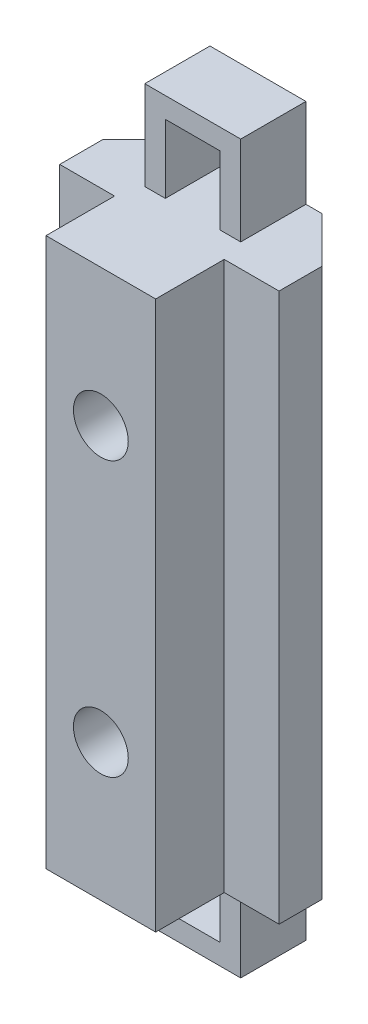
ISO-10303-21;
HEADER;
FILE_DESCRIPTION(('STEP AP214'),'2;1');
FILE_NAME('part.step','',(''),(''),'','','');
FILE_SCHEMA(('AUTOMOTIVE_DESIGN { 1 0 10303 214 1 1 1 1 }'));
ENDSEC;
DATA;
#1=APPLICATION_CONTEXT('core data for automotive mechanical design processes');
#2=APPLICATION_PROTOCOL_DEFINITION('international standard','automotive_design',2000,#1);
#3=PRODUCT_CONTEXT('',#1,'mechanical');
#4=PRODUCT('Part','Part','',(#3));
#5=PRODUCT_RELATED_PRODUCT_CATEGORY('part','',(#4));
#6=PRODUCT_DEFINITION_FORMATION('','',#4);
#7=PRODUCT_DEFINITION_CONTEXT('part definition',#1,'design');
#8=PRODUCT_DEFINITION('design','',#6,#7);
#9=PRODUCT_DEFINITION_SHAPE('','',#8);
#10=(LENGTH_UNIT() NAMED_UNIT(*) SI_UNIT(.MILLI.,.METRE.));
#11=(NAMED_UNIT(*) PLANE_ANGLE_UNIT() SI_UNIT($,.RADIAN.));
#12=(NAMED_UNIT(*) SI_UNIT($,.STERADIAN.) SOLID_ANGLE_UNIT());
#13=UNCERTAINTY_MEASURE_WITH_UNIT(LENGTH_MEASURE(1.E-05),#10,'distance_accuracy_value','');
#14=(GEOMETRIC_REPRESENTATION_CONTEXT(3) GLOBAL_UNCERTAINTY_ASSIGNED_CONTEXT((#13)) GLOBAL_UNIT_ASSIGNED_CONTEXT((#10,
#11,#12)) REPRESENTATION_CONTEXT('',''));
#15=CARTESIAN_POINT('',(0.,0.,0.));
#16=DIRECTION('',(0.,0.,1.));
#17=DIRECTION('',(1.,0.,0.));
#18=AXIS2_PLACEMENT_3D('',#15,#16,#17);
#19=CARTESIAN_POINT('',(0.,0.,0.));
#20=DIRECTION('',(0.,0.,-1.));
#21=DIRECTION('',(-1.,0.,0.));
#22=AXIS2_PLACEMENT_3D('',#19,#20,#21);
#23=PLANE('',#22);
#24=DIRECTION('',(0.,-1.,0.));
#25=VECTOR('',#24,1.);
#26=CARTESIAN_POINT('',(-1.74789245707197,40.,0.));
#27=LINE('',#26,#25);
#28=CARTESIAN_POINT('',(-1.74789245707196,40.,0.));
#29=VERTEX_POINT('',#28);
#30=CARTESIAN_POINT('',(-1.74789245707196,0.,0.));
#31=VERTEX_POINT('',#30);
#32=EDGE_CURVE('E63',#29,#31,#27,.T.);
#33=ORIENTED_EDGE('',*,*,#32,.F.);
#34=DIRECTION('',(1.,0.,0.));
#35=VECTOR('',#34,1.);
#36=CARTESIAN_POINT('',(9.75210754292804,40.,0.));
#37=LINE('',#36,#35);
#38=CARTESIAN_POINT('',(-5.74789245707196,40.,0.));
#39=VERTEX_POINT('',#38);
#40=EDGE_CURVE('E463',#39,#29,#37,.T.);
#41=ORIENTED_EDGE('',*,*,#40,.F.);
#42=DIRECTION('',(0.,1.,0.));
#43=VECTOR('',#42,1.);
#44=CARTESIAN_POINT('',(-5.74789245707196,40.,0.));
#45=LINE('',#44,#43);
#46=CARTESIAN_POINT('',(-5.74789245707196,0.,0.));
#47=VERTEX_POINT('',#46);
#48=EDGE_CURVE('E367',#47,#39,#45,.T.);
#49=ORIENTED_EDGE('',*,*,#48,.F.);
#50=DIRECTION('',(-1.,0.,0.));
#51=VECTOR('',#50,1.);
#52=CARTESIAN_POINT('',(9.75210754292804,0.,0.));
#53=LINE('',#52,#51);
#54=EDGE_CURVE('E465',#31,#47,#53,.T.);
#55=ORIENTED_EDGE('',*,*,#54,.F.);
#56=EDGE_LOOP('',(#33,#41,#49,#55));
#57=FACE_BOUND('',#56,.T.);
#58=ADVANCED_FACE('F38',(#57),#23,.F.);
#59=CARTESIAN_POINT('',(0.,0.,0.));
#60=DIRECTION('',(0.,1.,0.));
#61=DIRECTION('',(0.,0.,1.));
#62=AXIS2_PLACEMENT_3D('',#59,#60,#61);
#63=PLANE('',#62);
#64=DIRECTION('',(1.,0.,0.));
#65=VECTOR('',#64,1.);
#66=CARTESIAN_POINT('',(0.,0.,-5.32842712474617));
#67=LINE('',#66,#65);
#68=CARTESIAN_POINT('',(0.,0.,-5.32842712474617));
#69=VERTEX_POINT('',#68);
#70=CARTESIAN_POINT('',(0.252107542927994,0.,-5.32842712474617));
#71=VERTEX_POINT('',#70);
#72=EDGE_CURVE('E343',#69,#71,#67,.T.);
#73=ORIENTED_EDGE('',*,*,#72,.F.);
#74=DIRECTION('',(0.,0.,1.));
#75=VECTOR('',#74,1.);
#76=CARTESIAN_POINT('',(0.,0.,-16.012284561916));
#77=LINE('',#76,#75);
#78=CARTESIAN_POINT('',(0.,0.,-6.45979797464463));
#79=VERTEX_POINT('',#78);
#80=EDGE_CURVE('E324',#79,#69,#77,.T.);
#81=ORIENTED_EDGE('',*,*,#80,.F.);
#82=DIRECTION('',(1.,0.,0.));
#83=VECTOR('',#82,1.);
#84=CARTESIAN_POINT('',(0.,0.,-6.45979797464463));
#85=LINE('',#84,#83);
#86=CARTESIAN_POINT('',(4.252107542928,0.,-6.45979797464463));
#87=VERTEX_POINT('',#86);
#88=EDGE_CURVE('E338',#79,#87,#85,.T.);
#89=ORIENTED_EDGE('',*,*,#88,.T.);
#90=DIRECTION('',(0.,0.,-1.));
#91=VECTOR('',#90,1.);
#92=CARTESIAN_POINT('',(4.25210754292799,0.,-1.70258565579235));
#93=LINE('',#92,#91);
#94=CARTESIAN_POINT('',(4.25210754292799,0.,-1.70258565579235));
#95=VERTEX_POINT('',#94);
#96=EDGE_CURVE('E430',#95,#87,#93,.T.);
#97=ORIENTED_EDGE('',*,*,#96,.F.);
#98=DIRECTION('',(-1.,0.,0.));
#99=VECTOR('',#98,1.);
#100=CARTESIAN_POINT('',(0.,0.,-1.70258565579235));
#101=LINE('',#100,#99);
#102=CARTESIAN_POINT('',(5.75210754292799,0.,-1.70258565579235));
#103=VERTEX_POINT('',#102);
#104=EDGE_CURVE('E453',#103,#95,#101,.T.);
#105=ORIENTED_EDGE('',*,*,#104,.F.);
#106=DIRECTION('',(0.,0.,-1.));
#107=VECTOR('',#106,1.);
#108=CARTESIAN_POINT('',(5.75210754292799,0.,-1.70258565579235));
#109=LINE('',#108,#107);
#110=CARTESIAN_POINT('',(5.75210754292799,0.,-6.45979797464463));
#111=VERTEX_POINT('',#110);
#112=EDGE_CURVE('E434',#103,#111,#109,.T.);
#113=ORIENTED_EDGE('',*,*,#112,.T.);
#114=CARTESIAN_POINT('',(6.92368041818186,0.,-6.45979797464463));
#115=VERTEX_POINT('',#114);
#116=EDGE_CURVE('E339',#111,#115,#85,.T.);
#117=ORIENTED_EDGE('',*,*,#116,.T.);
#118=DIRECTION('',(0.707106781186549,0.,0.707106781186546));
#119=VECTOR('',#118,1.);
#120=CARTESIAN_POINT('',(6.69173919641323,0.,-6.69173919641326));
#121=LINE('',#120,#119);
#122=CARTESIAN_POINT('',(10.252107542928,0.,-3.13137084989848));
#123=VERTEX_POINT('',#122);
#124=EDGE_CURVE('E331',#115,#123,#121,.T.);
#125=ORIENTED_EDGE('',*,*,#124,.T.);
#126=DIRECTION('',(0.,0.,-1.));
#127=VECTOR('',#126,1.);
#128=CARTESIAN_POINT('',(10.252107542928,0.,-2.5));
#129=LINE('',#128,#127);
#130=CARTESIAN_POINT('',(10.252107542928,0.,0.));
#131=VERTEX_POINT('',#130);
#132=EDGE_CURVE('E378',#131,#123,#129,.T.);
#133=ORIENTED_EDGE('',*,*,#132,.F.);
#134=CARTESIAN_POINT('',(6.25210754292804,0.,0.));
#135=VERTEX_POINT('',#134);
#136=EDGE_CURVE('E248',#131,#135,#53,.T.);
#137=ORIENTED_EDGE('',*,*,#136,.T.);
#138=DIRECTION('',(0.,0.,-1.));
#139=VECTOR('',#138,1.);
#140=CARTESIAN_POINT('',(6.25210754292804,0.,5.));
#141=LINE('',#140,#139);
#142=CARTESIAN_POINT('',(6.25210754292804,0.,5.));
#143=VERTEX_POINT('',#142);
#144=EDGE_CURVE('E55',#143,#135,#141,.T.);
#145=ORIENTED_EDGE('',*,*,#144,.F.);
#146=DIRECTION('',(1.,0.,0.));
#147=VECTOR('',#146,1.);
#148=CARTESIAN_POINT('',(0.,0.,5.));
#149=LINE('',#148,#147);
#150=CARTESIAN_POINT('',(-1.74789245707196,0.,5.));
#151=VERTEX_POINT('',#150);
#152=EDGE_CURVE('E11',#151,#143,#149,.T.);
#153=ORIENTED_EDGE('',*,*,#152,.F.);
#154=DIRECTION('',(0.,0.,1.));
#155=VECTOR('',#154,1.);
#156=CARTESIAN_POINT('',(-1.74789245707196,0.,5.));
#157=LINE('',#156,#155);
#158=EDGE_CURVE('E264',#31,#151,#157,.T.);
#159=ORIENTED_EDGE('',*,*,#158,.F.);
#160=ORIENTED_EDGE('',*,*,#54,.T.);
#161=DIRECTION('',(0.,0.,1.));
#162=VECTOR('',#161,1.);
#163=CARTESIAN_POINT('',(-5.74789245707196,0.,-2.5));
#164=LINE('',#163,#162);
#165=CARTESIAN_POINT('',(-5.74789245707196,0.,-3.13137084989846));
#166=VERTEX_POINT('',#165);
#167=EDGE_CURVE('E334',#166,#47,#164,.T.);
#168=ORIENTED_EDGE('',*,*,#167,.F.);
#169=DIRECTION('',(0.707106781186544,0.,-0.707106781186551));
#170=VECTOR('',#169,1.);
#171=CARTESIAN_POINT('',(-4.43963165348524,0.,-4.4396316534852));
#172=LINE('',#171,#170);
#173=CARTESIAN_POINT('',(-2.41946533232582,0.,-6.45979797464463));
#174=VERTEX_POINT('',#173);
#175=EDGE_CURVE('E340',#166,#174,#172,.T.);
#176=ORIENTED_EDGE('',*,*,#175,.T.);
#177=CARTESIAN_POINT('',(-1.247892457072,0.,-6.45979797464463));
#178=VERTEX_POINT('',#177);
#179=EDGE_CURVE('E335',#174,#178,#85,.T.);
#180=ORIENTED_EDGE('',*,*,#179,.T.);
#181=DIRECTION('',(0.,0.,-1.));
#182=VECTOR('',#181,1.);
#183=CARTESIAN_POINT('',(-1.24789245707201,0.,-1.70258565579235));
#184=LINE('',#183,#182);
#185=CARTESIAN_POINT('',(-1.24789245707201,0.,-1.70258565579235));
#186=VERTEX_POINT('',#185);
#187=EDGE_CURVE('E440',#186,#178,#184,.T.);
#188=ORIENTED_EDGE('',*,*,#187,.F.);
#189=CARTESIAN_POINT('',(0.252107542927994,0.,-1.70258565579235));
#190=VERTEX_POINT('',#189);
#191=EDGE_CURVE('E428',#190,#186,#101,.T.);
#192=ORIENTED_EDGE('',*,*,#191,.F.);
#193=DIRECTION('',(0.,0.,-1.));
#194=VECTOR('',#193,1.);
#195=CARTESIAN_POINT('',(0.252107542927994,0.,-1.70258565579235));
#196=LINE('',#195,#194);
#197=EDGE_CURVE('E437',#190,#71,#196,.T.);
#198=ORIENTED_EDGE('',*,*,#197,.T.);
#199=EDGE_LOOP('',(#73,#81,#89,#97,#105,#113,#117,#125,#133,#137,#145,#153,#159,#160,#168,#176,
#180,#188,#192,#198));
#200=FACE_BOUND('',#199,.T.);
#201=ADVANCED_FACE('F246',(#200),#63,.F.);
#202=CARTESIAN_POINT('',(0.,55.2643375224737,-5.32842712474617));
#203=DIRECTION('',(0.,0.,1.));
#204=DIRECTION('',(1.,0.,0.));
#205=AXIS2_PLACEMENT_3D('',#202,#203,#204);
#206=PLANE('',#205);
#207=DIRECTION('',(-1.,0.,0.));
#208=VECTOR('',#207,1.);
#209=CARTESIAN_POINT('',(0.,-5.,-5.32842712474617));
#210=LINE('',#209,#208);
#211=CARTESIAN_POINT('',(0.252107542927994,-5.,-5.32842712474618));
#212=VERTEX_POINT('',#211);
#213=CARTESIAN_POINT('',(0.,-5.,-5.32842712474617));
#214=VERTEX_POINT('',#213);
#215=EDGE_CURVE('E304',#212,#214,#210,.T.);
#216=ORIENTED_EDGE('',*,*,#215,.T.);
#217=DIRECTION('',(0.,1.,0.));
#218=VECTOR('',#217,1.);
#219=CARTESIAN_POINT('',(0.,0.,-5.32842712474617));
#220=LINE('',#219,#218);
#221=EDGE_CURVE('E307',#214,#69,#220,.T.);
#222=ORIENTED_EDGE('',*,*,#221,.T.);
#223=ORIENTED_EDGE('',*,*,#72,.T.);
#224=DIRECTION('',(0.,1.,0.));
#225=VECTOR('',#224,1.);
#226=CARTESIAN_POINT('',(0.252107542927994,0.,-5.32842712474618));
#227=LINE('',#226,#225);
#228=EDGE_CURVE('E380',#212,#71,#227,.T.);
#229=ORIENTED_EDGE('',*,*,#228,.F.);
#230=EDGE_LOOP('',(#216,#222,#223,#229));
#231=FACE_BOUND('',#230,.T.);
#232=ADVANCED_FACE('F493',(#231),#206,.F.);
#233=CARTESIAN_POINT('',(0.,40.,0.));
#234=DIRECTION('',(0.,1.,0.));
#235=DIRECTION('',(0.,0.,1.));
#236=AXIS2_PLACEMENT_3D('',#233,#234,#235);
#237=PLANE('',#236);
#238=DIRECTION('',(0.,0.,-1.));
#239=VECTOR('',#238,1.);
#240=CARTESIAN_POINT('',(4.252107542928,40.,-1.70258565579235));
#241=LINE('',#240,#239);
#242=CARTESIAN_POINT('',(4.252107542928,40.,-1.70258565579235));
#243=VERTEX_POINT('',#242);
#244=CARTESIAN_POINT('',(4.25210754292799,40.,-6.45979797464463));
#245=VERTEX_POINT('',#244);
#246=EDGE_CURVE('E407',#243,#245,#241,.T.);
#247=ORIENTED_EDGE('',*,*,#246,.T.);
#248=DIRECTION('',(1.,0.,0.));
#249=VECTOR('',#248,1.);
#250=CARTESIAN_POINT('',(0.,40.,-6.45979797464463));
#251=LINE('',#250,#249);
#252=CARTESIAN_POINT('',(0.252107542927993,40.,-6.45979797464463));
#253=VERTEX_POINT('',#252);
#254=EDGE_CURVE('E353',#253,#245,#251,.T.);
#255=ORIENTED_EDGE('',*,*,#254,.F.);
#256=DIRECTION('',(0.,0.,-1.));
#257=VECTOR('',#256,1.);
#258=CARTESIAN_POINT('',(0.252107542927995,40.,-1.70258565579235));
#259=LINE('',#258,#257);
#260=CARTESIAN_POINT('',(0.252107542927995,40.,-1.70258565579235));
#261=VERTEX_POINT('',#260);
#262=EDGE_CURVE('E418',#261,#253,#259,.T.);
#263=ORIENTED_EDGE('',*,*,#262,.F.);
#264=DIRECTION('',(1.,0.,0.));
#265=VECTOR('',#264,1.);
#266=CARTESIAN_POINT('',(0.,40.,-1.70258565579235));
#267=LINE('',#266,#265);
#268=CARTESIAN_POINT('',(-1.24789245707201,40.,-1.70258565579235));
#269=VERTEX_POINT('',#268);
#270=EDGE_CURVE('E397',#269,#261,#267,.T.);
#271=ORIENTED_EDGE('',*,*,#270,.F.);
#272=DIRECTION('',(0.,0.,-1.));
#273=VECTOR('',#272,1.);
#274=CARTESIAN_POINT('',(-1.24789245707201,40.,-1.70258565579235));
#275=LINE('',#274,#273);
#276=CARTESIAN_POINT('',(-1.247892457072,40.,-6.45979797464463));
#277=VERTEX_POINT('',#276);
#278=EDGE_CURVE('E416',#269,#277,#275,.T.);
#279=ORIENTED_EDGE('',*,*,#278,.T.);
#280=CARTESIAN_POINT('',(-2.41946533232582,40.,-6.45979797464463));
#281=VERTEX_POINT('',#280);
#282=EDGE_CURVE('E350',#281,#277,#251,.T.);
#283=ORIENTED_EDGE('',*,*,#282,.F.);
#284=DIRECTION('',(0.707106781186544,0.,-0.707106781186551));
#285=VECTOR('',#284,1.);
#286=CARTESIAN_POINT('',(-4.43963165348524,40.,-4.4396316534852));
#287=LINE('',#286,#285);
#288=CARTESIAN_POINT('',(-5.74789245707196,40.,-3.13137084989846));
#289=VERTEX_POINT('',#288);
#290=EDGE_CURVE('E346',#289,#281,#287,.T.);
#291=ORIENTED_EDGE('',*,*,#290,.F.);
#292=DIRECTION('',(0.,0.,-1.));
#293=VECTOR('',#292,1.);
#294=CARTESIAN_POINT('',(-5.74789245707196,40.,-2.5));
#295=LINE('',#294,#293);
#296=EDGE_CURVE('E370',#39,#289,#295,.T.);
#297=ORIENTED_EDGE('',*,*,#296,.F.);
#298=ORIENTED_EDGE('',*,*,#40,.T.);
#299=DIRECTION('',(0.,0.,-1.));
#300=VECTOR('',#299,1.);
#301=CARTESIAN_POINT('',(-1.74789245707197,40.,5.));
#302=LINE('',#301,#300);
#303=CARTESIAN_POINT('',(-1.74789245707197,40.,5.));
#304=VERTEX_POINT('',#303);
#305=EDGE_CURVE('E260',#304,#29,#302,.T.);
#306=ORIENTED_EDGE('',*,*,#305,.F.);
#307=DIRECTION('',(-1.,0.,0.));
#308=VECTOR('',#307,1.);
#309=CARTESIAN_POINT('',(0.,40.,5.));
#310=LINE('',#309,#308);
#311=CARTESIAN_POINT('',(6.25210754292803,40.,5.));
#312=VERTEX_POINT('',#311);
#313=EDGE_CURVE('E47',#312,#304,#310,.T.);
#314=ORIENTED_EDGE('',*,*,#313,.F.);
#315=DIRECTION('',(0.,0.,1.));
#316=VECTOR('',#315,1.);
#317=CARTESIAN_POINT('',(6.25210754292803,40.,5.));
#318=LINE('',#317,#316);
#319=CARTESIAN_POINT('',(6.25210754292803,40.,0.));
#320=VERTEX_POINT('',#319);
#321=EDGE_CURVE('E254',#320,#312,#318,.T.);
#322=ORIENTED_EDGE('',*,*,#321,.F.);
#323=CARTESIAN_POINT('',(10.252107542928,40.,0.));
#324=VERTEX_POINT('',#323);
#325=EDGE_CURVE('E436',#320,#324,#37,.T.);
#326=ORIENTED_EDGE('',*,*,#325,.T.);
#327=DIRECTION('',(0.,0.,1.));
#328=VECTOR('',#327,1.);
#329=CARTESIAN_POINT('',(10.252107542928,40.,-2.5));
#330=LINE('',#329,#328);
#331=CARTESIAN_POINT('',(10.252107542928,40.,-3.13137084989848));
#332=VERTEX_POINT('',#331);
#333=EDGE_CURVE('E372',#332,#324,#330,.T.);
#334=ORIENTED_EDGE('',*,*,#333,.F.);
#335=DIRECTION('',(0.707106781186549,0.,0.707106781186546));
#336=VECTOR('',#335,1.);
#337=CARTESIAN_POINT('',(6.69173919641323,40.,-6.69173919641326));
#338=LINE('',#337,#336);
#339=CARTESIAN_POINT('',(6.92368041818186,40.,-6.45979797464463));
#340=VERTEX_POINT('',#339);
#341=EDGE_CURVE('E313',#340,#332,#338,.T.);
#342=ORIENTED_EDGE('',*,*,#341,.F.);
#343=CARTESIAN_POINT('',(5.75210754292799,40.,-6.45979797464463));
#344=VERTEX_POINT('',#343);
#345=EDGE_CURVE('E354',#344,#340,#251,.T.);
#346=ORIENTED_EDGE('',*,*,#345,.F.);
#347=DIRECTION('',(0.,0.,-1.));
#348=VECTOR('',#347,1.);
#349=CARTESIAN_POINT('',(5.75210754292799,40.,-1.70258565579235));
#350=LINE('',#349,#348);
#351=CARTESIAN_POINT('',(5.75210754292799,40.,-1.70258565579235));
#352=VERTEX_POINT('',#351);
#353=EDGE_CURVE('E410',#352,#344,#350,.T.);
#354=ORIENTED_EDGE('',*,*,#353,.F.);
#355=EDGE_CURVE('E400',#243,#352,#267,.T.);
#356=ORIENTED_EDGE('',*,*,#355,.F.);
#357=EDGE_LOOP('',(#247,#255,#263,#271,#279,#283,#291,#297,#298,#306,#314,#322,#326,#334,#342,
#346,#354,#356));
#358=FACE_BOUND('',#357,.T.);
#359=ADVANCED_FACE('F498',(#358),#237,.T.);
#360=CARTESIAN_POINT('',(2.25210754292804,10.,-2.));
#361=DIRECTION('',(0.,0.,1.));
#362=DIRECTION('',(1.,0.,0.));
#363=AXIS2_PLACEMENT_3D('',#360,#361,#362);
#364=CYLINDRICAL_SURFACE('',#363,2.);
#365=CARTESIAN_POINT('',(2.25210754292804,10.,-3.55558709696881));
#366=DIRECTION('',(0.,0.,-1.));
#367=DIRECTION('',(-1.,0.,0.));
#368=AXIS2_PLACEMENT_3D('',#365,#366,#367);
#369=CIRCLE('',#368,2.);
#370=CARTESIAN_POINT('',(0.252107542928039,10.,-3.55558709696881));
#371=VERTEX_POINT('',#370);
#372=EDGE_CURVE('E270',#371,#371,#369,.T.);
#373=ORIENTED_EDGE('',*,*,#372,.T.);
#374=EDGE_LOOP('',(#373));
#375=FACE_BOUND('',#374,.T.);
#376=CARTESIAN_POINT('',(2.25210754292804,10.,5.));
#377=DIRECTION('',(0.,0.,1.));
#378=DIRECTION('',(1.,0.,0.));
#379=AXIS2_PLACEMENT_3D('',#376,#377,#378);
#380=CIRCLE('',#379,2.);
#381=CARTESIAN_POINT('',(4.25210754292804,10.,5.));
#382=VERTEX_POINT('',#381);
#383=EDGE_CURVE('E466',#382,#382,#380,.T.);
#384=ORIENTED_EDGE('',*,*,#383,.T.);
#385=EDGE_LOOP('',(#384));
#386=FACE_BOUND('',#385,.T.);
#387=ADVANCED_FACE('F486',(#375,#386),#364,.F.);
#388=CARTESIAN_POINT('',(2.25210754292803,30.,-2.));
#389=DIRECTION('',(0.,0.,1.));
#390=DIRECTION('',(1.,0.,0.));
#391=AXIS2_PLACEMENT_3D('',#388,#389,#390);
#392=CYLINDRICAL_SURFACE('',#391,2.);
#393=CARTESIAN_POINT('',(2.25210754292803,30.,-3.55558709696882));
#394=DIRECTION('',(0.,0.,-1.));
#395=DIRECTION('',(-1.,0.,0.));
#396=AXIS2_PLACEMENT_3D('',#393,#394,#395);
#397=CIRCLE('',#396,2.);
#398=CARTESIAN_POINT('',(0.252107542928033,30.,-3.55558709696882));
#399=VERTEX_POINT('',#398);
#400=EDGE_CURVE('E275',#399,#399,#397,.T.);
#401=ORIENTED_EDGE('',*,*,#400,.T.);
#402=EDGE_LOOP('',(#401));
#403=FACE_BOUND('',#402,.T.);
#404=CARTESIAN_POINT('',(2.25210754292803,30.,5.));
#405=DIRECTION('',(0.,0.,1.));
#406=DIRECTION('',(1.,0.,0.));
#407=AXIS2_PLACEMENT_3D('',#404,#405,#406);
#408=CIRCLE('',#407,2.);
#409=CARTESIAN_POINT('',(4.25210754292803,30.,5.));
#410=VERTEX_POINT('',#409);
#411=EDGE_CURVE('E42',#410,#410,#408,.T.);
#412=ORIENTED_EDGE('',*,*,#411,.T.);
#413=EDGE_LOOP('',(#412));
#414=FACE_BOUND('',#413,.T.);
#415=ADVANCED_FACE('F40',(#403,#414),#392,.F.);
#416=CARTESIAN_POINT('',(0.,0.,5.));
#417=DIRECTION('',(0.,0.,1.));
#418=DIRECTION('',(1.,0.,0.));
#419=AXIS2_PLACEMENT_3D('',#416,#417,#418);
#420=PLANE('',#419);
#421=ORIENTED_EDGE('',*,*,#411,.F.);
#422=EDGE_LOOP('',(#421));
#423=FACE_BOUND('',#422,.T.);
#424=ORIENTED_EDGE('',*,*,#383,.F.);
#425=EDGE_LOOP('',(#424));
#426=FACE_BOUND('',#425,.T.);
#427=ORIENTED_EDGE('',*,*,#152,.T.);
#428=DIRECTION('',(0.,-1.,0.));
#429=VECTOR('',#428,1.);
#430=CARTESIAN_POINT('',(6.25210754292803,40.,5.));
#431=LINE('',#430,#429);
#432=EDGE_CURVE('E238',#312,#143,#431,.T.);
#433=ORIENTED_EDGE('',*,*,#432,.F.);
#434=ORIENTED_EDGE('',*,*,#313,.T.);
#435=DIRECTION('',(0.,1.,0.));
#436=VECTOR('',#435,1.);
#437=CARTESIAN_POINT('',(-1.74789245707197,40.,5.));
#438=LINE('',#437,#436);
#439=EDGE_CURVE('E240',#151,#304,#438,.T.);
#440=ORIENTED_EDGE('',*,*,#439,.F.);
#441=EDGE_LOOP('',(#427,#433,#434,#440));
#442=FACE_BOUND('',#441,.T.);
#443=ADVANCED_FACE('F237',(#423,#426,#442),#420,.T.);
#444=ORIENTED_EDGE('',*,*,#325,.F.);
#445=DIRECTION('',(0.,1.,0.));
#446=VECTOR('',#445,1.);
#447=CARTESIAN_POINT('',(6.25210754292803,40.,0.));
#448=LINE('',#447,#446);
#449=EDGE_CURVE('E249',#135,#320,#448,.T.);
#450=ORIENTED_EDGE('',*,*,#449,.F.);
#451=ORIENTED_EDGE('',*,*,#136,.F.);
#452=DIRECTION('',(0.,-1.,0.));
#453=VECTOR('',#452,1.);
#454=CARTESIAN_POINT('',(10.252107542928,40.,0.));
#455=LINE('',#454,#453);
#456=EDGE_CURVE('E375',#324,#131,#455,.T.);
#457=ORIENTED_EDGE('',*,*,#456,.F.);
#458=EDGE_LOOP('',(#444,#450,#451,#457));
#459=FACE_BOUND('',#458,.T.);
#460=ADVANCED_FACE('F477',(#459),#23,.F.);
#461=CARTESIAN_POINT('',(0.,-6.5,-1.70258565579235));
#462=DIRECTION('',(0.,-1.,0.));
#463=DIRECTION('',(0.,0.,-1.));
#464=AXIS2_PLACEMENT_3D('',#461,#462,#463);
#465=PLANE('',#464);
#466=DIRECTION('',(0.,0.,-1.));
#467=VECTOR('',#466,1.);
#468=CARTESIAN_POINT('',(-1.24789245707201,-6.5,-1.70258565579235));
#469=LINE('',#468,#467);
#470=CARTESIAN_POINT('',(-1.24789245707201,-6.5,-1.70258565579235));
#471=VERTEX_POINT('',#470);
#472=CARTESIAN_POINT('',(-1.24789245707201,-6.5,-6.45979797464463));
#473=VERTEX_POINT('',#472);
#474=EDGE_CURVE('E441',#471,#473,#469,.T.);
#475=ORIENTED_EDGE('',*,*,#474,.T.);
#476=DIRECTION('',(-1.,0.,0.));
#477=VECTOR('',#476,1.);
#478=CARTESIAN_POINT('',(0.,-6.5,-6.45979797464463));
#479=LINE('',#478,#477);
#480=CARTESIAN_POINT('',(5.75210754292799,-6.5,-6.45979797464463));
#481=VERTEX_POINT('',#480);
#482=EDGE_CURVE('E314',#481,#473,#479,.T.);
#483=ORIENTED_EDGE('',*,*,#482,.F.);
#484=DIRECTION('',(0.,0.,-1.));
#485=VECTOR('',#484,1.);
#486=CARTESIAN_POINT('',(5.75210754292799,-6.5,-1.70258565579235));
#487=LINE('',#486,#485);
#488=CARTESIAN_POINT('',(5.75210754292799,-6.5,-1.70258565579235));
#489=VERTEX_POINT('',#488);
#490=EDGE_CURVE('E438',#489,#481,#487,.T.);
#491=ORIENTED_EDGE('',*,*,#490,.F.);
#492=DIRECTION('',(-1.,0.,0.));
#493=VECTOR('',#492,1.);
#494=CARTESIAN_POINT('',(0.,-6.5,-1.70258565579235));
#495=LINE('',#494,#493);
#496=EDGE_CURVE('E409',#489,#471,#495,.T.);
#497=ORIENTED_EDGE('',*,*,#496,.T.);
#498=EDGE_LOOP('',(#475,#483,#491,#497));
#499=FACE_BOUND('',#498,.T.);
#500=ADVANCED_FACE('F483',(#499),#465,.T.);
#501=CARTESIAN_POINT('',(0.,-5.,-1.70258565579235));
#502=DIRECTION('',(0.,1.,0.));
#503=DIRECTION('',(0.,0.,1.));
#504=AXIS2_PLACEMENT_3D('',#501,#502,#503);
#505=PLANE('',#504);
#506=DIRECTION('',(0.,0.,-1.));
#507=VECTOR('',#506,1.);
#508=CARTESIAN_POINT('',(4.25210754292799,-5.,-1.70258565579235));
#509=LINE('',#508,#507);
#510=CARTESIAN_POINT('',(4.25210754292799,-5.,-1.70258565579235));
#511=VERTEX_POINT('',#510);
#512=CARTESIAN_POINT('',(4.25210754292799,-5.,-6.45979797464463));
#513=VERTEX_POINT('',#512);
#514=EDGE_CURVE('E426',#511,#513,#509,.T.);
#515=ORIENTED_EDGE('',*,*,#514,.T.);
#516=DIRECTION('',(-1.,0.,0.));
#517=VECTOR('',#516,1.);
#518=CARTESIAN_POINT('',(0.,-5.,-6.45979797464463));
#519=LINE('',#518,#517);
#520=CARTESIAN_POINT('',(0.,-5.,-6.45979797464463));
#521=VERTEX_POINT('',#520);
#522=EDGE_CURVE('E322',#513,#521,#519,.T.);
#523=ORIENTED_EDGE('',*,*,#522,.T.);
#524=DIRECTION('',(0.,0.,1.));
#525=VECTOR('',#524,1.);
#526=CARTESIAN_POINT('',(0.,-5.,-16.012284561916));
#527=LINE('',#526,#525);
#528=EDGE_CURVE('E309',#521,#214,#527,.T.);
#529=ORIENTED_EDGE('',*,*,#528,.T.);
#530=ORIENTED_EDGE('',*,*,#215,.F.);
#531=DIRECTION('',(0.,0.,-1.));
#532=VECTOR('',#531,1.);
#533=CARTESIAN_POINT('',(0.252107542927994,-5.,-1.70258565579235));
#534=LINE('',#533,#532);
#535=CARTESIAN_POINT('',(0.252107542927994,-5.,-1.70258565579235));
#536=VERTEX_POINT('',#535);
#537=EDGE_CURVE('E447',#536,#212,#534,.T.);
#538=ORIENTED_EDGE('',*,*,#537,.F.);
#539=DIRECTION('',(1.,0.,0.));
#540=VECTOR('',#539,1.);
#541=CARTESIAN_POINT('',(0.,-5.,-1.70258565579235));
#542=LINE('',#541,#540);
#543=EDGE_CURVE('E429',#536,#511,#542,.T.);
#544=ORIENTED_EDGE('',*,*,#543,.T.);
#545=EDGE_LOOP('',(#515,#523,#529,#530,#538,#544));
#546=FACE_BOUND('',#545,.T.);
#547=ADVANCED_FACE('F572',(#546),#505,.T.);
#548=CARTESIAN_POINT('',(0.,0.,-1.70258565579235));
#549=DIRECTION('',(0.,0.,-1.));
#550=DIRECTION('',(-1.,0.,0.));
#551=AXIS2_PLACEMENT_3D('',#548,#549,#550);
#552=PLANE('',#551);
#553=ORIENTED_EDGE('',*,*,#543,.F.);
#554=DIRECTION('',(0.,-1.,0.));
#555=VECTOR('',#554,1.);
#556=CARTESIAN_POINT('',(0.252107542927994,0.,-1.70258565579235));
#557=LINE('',#556,#555);
#558=EDGE_CURVE('E444',#190,#536,#557,.T.);
#559=ORIENTED_EDGE('',*,*,#558,.F.);
#560=ORIENTED_EDGE('',*,*,#191,.T.);
#561=DIRECTION('',(0.,-1.,0.));
#562=VECTOR('',#561,1.);
#563=CARTESIAN_POINT('',(-1.24789245707201,0.,-1.70258565579235));
#564=LINE('',#563,#562);
#565=EDGE_CURVE('E451',#186,#471,#564,.T.);
#566=ORIENTED_EDGE('',*,*,#565,.T.);
#567=ORIENTED_EDGE('',*,*,#496,.F.);
#568=DIRECTION('',(0.,-1.,0.));
#569=VECTOR('',#568,1.);
#570=CARTESIAN_POINT('',(5.75210754292799,0.,-1.70258565579235));
#571=LINE('',#570,#569);
#572=EDGE_CURVE('E432',#103,#489,#571,.T.);
#573=ORIENTED_EDGE('',*,*,#572,.F.);
#574=ORIENTED_EDGE('',*,*,#104,.T.);
#575=DIRECTION('',(0.,1.,0.));
#576=VECTOR('',#575,1.);
#577=CARTESIAN_POINT('',(4.25210754292799,0.,-1.70258565579235));
#578=LINE('',#577,#576);
#579=EDGE_CURVE('E433',#511,#95,#578,.T.);
#580=ORIENTED_EDGE('',*,*,#579,.F.);
#581=EDGE_LOOP('',(#553,#559,#560,#566,#567,#573,#574,#580));
#582=FACE_BOUND('',#581,.T.);
#583=ADVANCED_FACE('F496',(#582),#552,.F.);
#584=CARTESIAN_POINT('',(4.25210754292799,0.,-1.70258565579235));
#585=DIRECTION('',(-1.,0.,0.));
#586=DIRECTION('',(0.,-1.,0.));
#587=AXIS2_PLACEMENT_3D('',#584,#585,#586);
#588=PLANE('',#587);
#589=ORIENTED_EDGE('',*,*,#96,.T.);
#590=DIRECTION('',(0.,1.,0.));
#591=VECTOR('',#590,1.);
#592=CARTESIAN_POINT('',(4.25210754292799,0.,-6.45979797464463));
#593=LINE('',#592,#591);
#594=EDGE_CURVE('E306',#513,#87,#593,.T.);
#595=ORIENTED_EDGE('',*,*,#594,.F.);
#596=ORIENTED_EDGE('',*,*,#514,.F.);
#597=ORIENTED_EDGE('',*,*,#579,.T.);
#598=EDGE_LOOP('',(#589,#595,#596,#597));
#599=FACE_BOUND('',#598,.T.);
#600=ADVANCED_FACE('F584',(#599),#588,.T.);
#601=CARTESIAN_POINT('',(5.75210754292799,0.,-1.70258565579235));
#602=DIRECTION('',(1.,0.,0.));
#603=DIRECTION('',(0.,1.,0.));
#604=AXIS2_PLACEMENT_3D('',#601,#602,#603);
#605=PLANE('',#604);
#606=ORIENTED_EDGE('',*,*,#490,.T.);
#607=DIRECTION('',(0.,-1.,0.));
#608=VECTOR('',#607,1.);
#609=CARTESIAN_POINT('',(5.75210754292799,0.,-6.45979797464463));
#610=LINE('',#609,#608);
#611=EDGE_CURVE('E317',#111,#481,#610,.T.);
#612=ORIENTED_EDGE('',*,*,#611,.F.);
#613=ORIENTED_EDGE('',*,*,#112,.F.);
#614=ORIENTED_EDGE('',*,*,#572,.T.);
#615=EDGE_LOOP('',(#606,#612,#613,#614));
#616=FACE_BOUND('',#615,.T.);
#617=ADVANCED_FACE('F588',(#616),#605,.T.);
#618=CARTESIAN_POINT('',(-1.24789245707201,0.,-1.70258565579235));
#619=DIRECTION('',(1.,0.,0.));
#620=DIRECTION('',(0.,1.,0.));
#621=AXIS2_PLACEMENT_3D('',#618,#619,#620);
#622=PLANE('',#621);
#623=ORIENTED_EDGE('',*,*,#187,.T.);
#624=DIRECTION('',(0.,1.,0.));
#625=VECTOR('',#624,1.);
#626=CARTESIAN_POINT('',(-1.24789245707201,0.,-6.45979797464463));
#627=LINE('',#626,#625);
#628=EDGE_CURVE('E310',#473,#178,#627,.T.);
#629=ORIENTED_EDGE('',*,*,#628,.F.);
#630=ORIENTED_EDGE('',*,*,#474,.F.);
#631=ORIENTED_EDGE('',*,*,#565,.F.);
#632=EDGE_LOOP('',(#623,#629,#630,#631));
#633=FACE_BOUND('',#632,.T.);
#634=ADVANCED_FACE('F559',(#633),#622,.F.);
#635=CARTESIAN_POINT('',(0.252107542927994,0.,-1.70258565579235));
#636=DIRECTION('',(1.,0.,0.));
#637=DIRECTION('',(0.,0.,-1.));
#638=AXIS2_PLACEMENT_3D('',#635,#636,#637);
#639=PLANE('',#638);
#640=ORIENTED_EDGE('',*,*,#537,.T.);
#641=ORIENTED_EDGE('',*,*,#228,.T.);
#642=ORIENTED_EDGE('',*,*,#197,.F.);
#643=ORIENTED_EDGE('',*,*,#558,.T.);
#644=EDGE_LOOP('',(#640,#641,#642,#643));
#645=FACE_BOUND('',#644,.T.);
#646=ADVANCED_FACE('F569',(#645),#639,.T.);
#647=CARTESIAN_POINT('',(0.,45.,-1.70258565579235));
#648=DIRECTION('',(0.,1.,0.));
#649=DIRECTION('',(0.,0.,1.));
#650=AXIS2_PLACEMENT_3D('',#647,#648,#649);
#651=PLANE('',#650);
#652=DIRECTION('',(0.,0.,-1.));
#653=VECTOR('',#652,1.);
#654=CARTESIAN_POINT('',(0.252107542927994,45.,-1.70258565579235));
#655=LINE('',#654,#653);
#656=CARTESIAN_POINT('',(0.252107542927994,45.,-1.70258565579235));
#657=VERTEX_POINT('',#656);
#658=CARTESIAN_POINT('',(0.252107542927993,45.,-5.32842712474617));
#659=VERTEX_POINT('',#658);
#660=EDGE_CURVE('E420',#657,#659,#655,.T.);
#661=ORIENTED_EDGE('',*,*,#660,.T.);
#662=DIRECTION('',(1.,0.,0.));
#663=VECTOR('',#662,1.);
#664=CARTESIAN_POINT('',(0.,45.,-5.32842712474618));
#665=LINE('',#664,#663);
#666=CARTESIAN_POINT('',(4.25210754292799,45.,-5.32842712474617));
#667=VERTEX_POINT('',#666);
#668=EDGE_CURVE('E386',#659,#667,#665,.T.);
#669=ORIENTED_EDGE('',*,*,#668,.T.);
#670=DIRECTION('',(0.,0.,-1.));
#671=VECTOR('',#670,1.);
#672=CARTESIAN_POINT('',(4.25210754292799,45.,-1.70258565579235));
#673=LINE('',#672,#671);
#674=CARTESIAN_POINT('',(4.25210754292799,45.,-1.70258565579235));
#675=VERTEX_POINT('',#674);
#676=EDGE_CURVE('E423',#675,#667,#673,.T.);
#677=ORIENTED_EDGE('',*,*,#676,.F.);
#678=DIRECTION('',(1.,0.,0.));
#679=VECTOR('',#678,1.);
#680=CARTESIAN_POINT('',(0.,45.,-1.70258565579235));
#681=LINE('',#680,#679);
#682=EDGE_CURVE('E393',#657,#675,#681,.T.);
#683=ORIENTED_EDGE('',*,*,#682,.F.);
#684=EDGE_LOOP('',(#661,#669,#677,#683));
#685=FACE_BOUND('',#684,.T.);
#686=ADVANCED_FACE('F601',(#685),#651,.F.);
#687=CARTESIAN_POINT('',(0.,46.5,-1.70258565579235));
#688=DIRECTION('',(0.,-1.,0.));
#689=DIRECTION('',(0.,0.,-1.));
#690=AXIS2_PLACEMENT_3D('',#687,#688,#689);
#691=PLANE('',#690);
#692=DIRECTION('',(0.,0.,-1.));
#693=VECTOR('',#692,1.);
#694=CARTESIAN_POINT('',(5.75210754292799,46.5,-1.70258565579235));
#695=LINE('',#694,#693);
#696=CARTESIAN_POINT('',(5.75210754292799,46.5,-1.70258565579235));
#697=VERTEX_POINT('',#696);
#698=CARTESIAN_POINT('',(5.75210754292799,46.5,-6.45979797464463));
#699=VERTEX_POINT('',#698);
#700=EDGE_CURVE('E412',#697,#699,#695,.T.);
#701=ORIENTED_EDGE('',*,*,#700,.T.);
#702=DIRECTION('',(-1.,0.,0.));
#703=VECTOR('',#702,1.);
#704=CARTESIAN_POINT('',(0.,46.5,-6.45979797464463));
#705=LINE('',#704,#703);
#706=CARTESIAN_POINT('',(-1.247892457072,46.5,-6.45979797464463));
#707=VERTEX_POINT('',#706);
#708=EDGE_CURVE('E287',#699,#707,#705,.T.);
#709=ORIENTED_EDGE('',*,*,#708,.T.);
#710=DIRECTION('',(0.,0.,-1.));
#711=VECTOR('',#710,1.);
#712=CARTESIAN_POINT('',(-1.24789245707201,46.5,-1.70258565579235));
#713=LINE('',#712,#711);
#714=CARTESIAN_POINT('',(-1.24789245707201,46.5,-1.70258565579235));
#715=VERTEX_POINT('',#714);
#716=EDGE_CURVE('E414',#715,#707,#713,.T.);
#717=ORIENTED_EDGE('',*,*,#716,.F.);
#718=DIRECTION('',(-1.,0.,0.));
#719=VECTOR('',#718,1.);
#720=CARTESIAN_POINT('',(0.,46.5,-1.70258565579235));
#721=LINE('',#720,#719);
#722=EDGE_CURVE('E402',#697,#715,#721,.T.);
#723=ORIENTED_EDGE('',*,*,#722,.F.);
#724=EDGE_LOOP('',(#701,#709,#717,#723));
#725=FACE_BOUND('',#724,.T.);
#726=ADVANCED_FACE('F605',(#725),#691,.F.);
#727=CARTESIAN_POINT('',(0.,0.,-1.70258565579235));
#728=DIRECTION('',(0.,0.,-1.));
#729=DIRECTION('',(-1.,0.,0.));
#730=AXIS2_PLACEMENT_3D('',#727,#728,#729);
#731=PLANE('',#730);
#732=DIRECTION('',(0.,-1.,0.));
#733=VECTOR('',#732,1.);
#734=CARTESIAN_POINT('',(4.252107542928,0.,-1.70258565579235));
#735=LINE('',#734,#733);
#736=EDGE_CURVE('E391',#675,#243,#735,.T.);
#737=ORIENTED_EDGE('',*,*,#736,.T.);
#738=ORIENTED_EDGE('',*,*,#355,.T.);
#739=DIRECTION('',(0.,-1.,0.));
#740=VECTOR('',#739,1.);
#741=CARTESIAN_POINT('',(5.75210754292799,0.,-1.70258565579235));
#742=LINE('',#741,#740);
#743=EDGE_CURVE('E404',#697,#352,#742,.T.);
#744=ORIENTED_EDGE('',*,*,#743,.F.);
#745=ORIENTED_EDGE('',*,*,#722,.T.);
#746=DIRECTION('',(0.,-1.,0.));
#747=VECTOR('',#746,1.);
#748=CARTESIAN_POINT('',(-1.24789245707201,0.,-1.70258565579235));
#749=LINE('',#748,#747);
#750=EDGE_CURVE('E399',#715,#269,#749,.T.);
#751=ORIENTED_EDGE('',*,*,#750,.T.);
#752=ORIENTED_EDGE('',*,*,#270,.T.);
#753=DIRECTION('',(0.,1.,0.));
#754=VECTOR('',#753,1.);
#755=CARTESIAN_POINT('',(0.25210754292801,0.,-1.70258565579235));
#756=LINE('',#755,#754);
#757=EDGE_CURVE('E395',#261,#657,#756,.T.);
#758=ORIENTED_EDGE('',*,*,#757,.T.);
#759=ORIENTED_EDGE('',*,*,#682,.T.);
#760=EDGE_LOOP('',(#737,#738,#744,#745,#751,#752,#758,#759));
#761=FACE_BOUND('',#760,.T.);
#762=ADVANCED_FACE('F611',(#761),#731,.F.);
#763=CARTESIAN_POINT('',(0.25210754292801,0.,-1.70258565579235));
#764=DIRECTION('',(-1.,0.,0.));
#765=DIRECTION('',(0.,-1.,0.));
#766=AXIS2_PLACEMENT_3D('',#763,#764,#765);
#767=PLANE('',#766);
#768=ORIENTED_EDGE('',*,*,#262,.T.);
#769=DIRECTION('',(0.,-1.,0.));
#770=VECTOR('',#769,1.);
#771=CARTESIAN_POINT('',(0.252107542927993,0.,-6.45979797464463));
#772=LINE('',#771,#770);
#773=CARTESIAN_POINT('',(0.252107542927993,44.9531421866599,-6.45979797464463));
#774=VERTEX_POINT('',#773);
#775=EDGE_CURVE('E290',#774,#253,#772,.T.);
#776=ORIENTED_EDGE('',*,*,#775,.F.);
#777=DIRECTION('',(0.,0.,1.));
#778=VECTOR('',#777,1.);
#779=CARTESIAN_POINT('',(0.252107542927993,44.9531421866599,-16.012284561916));
#780=LINE('',#779,#778);
#781=CARTESIAN_POINT('',(0.252107542927993,44.9531421866599,-5.32842712474617));
#782=VERTEX_POINT('',#781);
#783=EDGE_CURVE('E296',#774,#782,#780,.T.);
#784=ORIENTED_EDGE('',*,*,#783,.T.);
#785=DIRECTION('',(0.,1.,0.));
#786=VECTOR('',#785,1.);
#787=CARTESIAN_POINT('',(0.252107542927993,0.,-5.32842712474618));
#788=LINE('',#787,#786);
#789=EDGE_CURVE('E383',#782,#659,#788,.T.);
#790=ORIENTED_EDGE('',*,*,#789,.T.);
#791=ORIENTED_EDGE('',*,*,#660,.F.);
#792=ORIENTED_EDGE('',*,*,#757,.F.);
#793=EDGE_LOOP('',(#768,#776,#784,#790,#791,#792));
#794=FACE_BOUND('',#793,.T.);
#795=ADVANCED_FACE('F616',(#794),#767,.F.);
#796=CARTESIAN_POINT('',(-1.24789245707201,0.,-1.70258565579235));
#797=DIRECTION('',(1.,0.,0.));
#798=DIRECTION('',(0.,0.,-1.));
#799=AXIS2_PLACEMENT_3D('',#796,#797,#798);
#800=PLANE('',#799);
#801=ORIENTED_EDGE('',*,*,#716,.T.);
#802=DIRECTION('',(0.,-1.,0.));
#803=VECTOR('',#802,1.);
#804=CARTESIAN_POINT('',(-1.247892457072,0.,-6.45979797464463));
#805=LINE('',#804,#803);
#806=EDGE_CURVE('E293',#707,#277,#805,.T.);
#807=ORIENTED_EDGE('',*,*,#806,.T.);
#808=ORIENTED_EDGE('',*,*,#278,.F.);
#809=ORIENTED_EDGE('',*,*,#750,.F.);
#810=EDGE_LOOP('',(#801,#807,#808,#809));
#811=FACE_BOUND('',#810,.T.);
#812=ADVANCED_FACE('F682',(#811),#800,.F.);
#813=CARTESIAN_POINT('',(5.75210754292799,0.,-1.70258565579235));
#814=DIRECTION('',(1.,0.,0.));
#815=DIRECTION('',(0.,0.,-1.));
#816=AXIS2_PLACEMENT_3D('',#813,#814,#815);
#817=PLANE('',#816);
#818=ORIENTED_EDGE('',*,*,#353,.T.);
#819=DIRECTION('',(0.,-1.,0.));
#820=VECTOR('',#819,1.);
#821=CARTESIAN_POINT('',(5.75210754292799,0.,-6.45979797464463));
#822=LINE('',#821,#820);
#823=EDGE_CURVE('E288',#699,#344,#822,.T.);
#824=ORIENTED_EDGE('',*,*,#823,.F.);
#825=ORIENTED_EDGE('',*,*,#700,.F.);
#826=ORIENTED_EDGE('',*,*,#743,.T.);
#827=EDGE_LOOP('',(#818,#824,#825,#826));
#828=FACE_BOUND('',#827,.T.);
#829=ADVANCED_FACE('F619',(#828),#817,.T.);
#830=CARTESIAN_POINT('',(4.252107542928,0.,-1.70258565579235));
#831=DIRECTION('',(1.,0.,0.));
#832=DIRECTION('',(0.,1.,0.));
#833=AXIS2_PLACEMENT_3D('',#830,#831,#832);
#834=PLANE('',#833);
#835=ORIENTED_EDGE('',*,*,#676,.T.);
#836=DIRECTION('',(0.,1.,0.));
#837=VECTOR('',#836,1.);
#838=CARTESIAN_POINT('',(4.25210754292799,0.,-5.32842712474618));
#839=LINE('',#838,#837);
#840=CARTESIAN_POINT('',(4.25210754292799,44.9531421866599,-5.32842712474617));
#841=VERTEX_POINT('',#840);
#842=EDGE_CURVE('E389',#841,#667,#839,.T.);
#843=ORIENTED_EDGE('',*,*,#842,.F.);
#844=DIRECTION('',(0.,0.,1.));
#845=VECTOR('',#844,1.);
#846=CARTESIAN_POINT('',(4.25210754292799,44.9531421866599,-16.012284561916));
#847=LINE('',#846,#845);
#848=CARTESIAN_POINT('',(4.25210754292799,44.9531421866599,-6.45979797464463));
#849=VERTEX_POINT('',#848);
#850=EDGE_CURVE('E283',#849,#841,#847,.T.);
#851=ORIENTED_EDGE('',*,*,#850,.F.);
#852=DIRECTION('',(0.,-1.,0.));
#853=VECTOR('',#852,1.);
#854=CARTESIAN_POINT('',(4.25210754292799,0.,-6.45979797464463));
#855=LINE('',#854,#853);
#856=EDGE_CURVE('E284',#849,#245,#855,.T.);
#857=ORIENTED_EDGE('',*,*,#856,.T.);
#858=ORIENTED_EDGE('',*,*,#246,.F.);
#859=ORIENTED_EDGE('',*,*,#736,.F.);
#860=EDGE_LOOP('',(#835,#843,#851,#857,#858,#859));
#861=FACE_BOUND('',#860,.T.);
#862=ADVANCED_FACE('F517',(#861),#834,.F.);
#863=CARTESIAN_POINT('',(10.252107542928,0.,0.));
#864=DIRECTION('',(-1.,0.,0.));
#865=DIRECTION('',(0.,-1.,0.));
#866=AXIS2_PLACEMENT_3D('',#863,#864,#865);
#867=PLANE('',#866);
#868=ORIENTED_EDGE('',*,*,#132,.T.);
#869=DIRECTION('',(0.,-1.,0.));
#870=VECTOR('',#869,1.);
#871=CARTESIAN_POINT('',(10.252107542928,56.4827182224292,-3.13137084989848));
#872=LINE('',#871,#870);
#873=EDGE_CURVE('E357',#332,#123,#872,.T.);
#874=ORIENTED_EDGE('',*,*,#873,.F.);
#875=ORIENTED_EDGE('',*,*,#333,.T.);
#876=ORIENTED_EDGE('',*,*,#456,.T.);
#877=EDGE_LOOP('',(#868,#874,#875,#876));
#878=FACE_BOUND('',#877,.T.);
#879=ADVANCED_FACE('F538',(#878),#867,.F.);
#880=CARTESIAN_POINT('',(-5.74789245707196,0.,0.));
#881=DIRECTION('',(-1.,0.,0.));
#882=DIRECTION('',(0.,-1.,0.));
#883=AXIS2_PLACEMENT_3D('',#880,#881,#882);
#884=PLANE('',#883);
#885=ORIENTED_EDGE('',*,*,#296,.T.);
#886=DIRECTION('',(0.,-1.,0.));
#887=VECTOR('',#886,1.);
#888=CARTESIAN_POINT('',(-5.74789245707196,56.4827182224292,-3.13137084989846));
#889=LINE('',#888,#887);
#890=EDGE_CURVE('E345',#289,#166,#889,.T.);
#891=ORIENTED_EDGE('',*,*,#890,.T.);
#892=ORIENTED_EDGE('',*,*,#167,.T.);
#893=ORIENTED_EDGE('',*,*,#48,.T.);
#894=EDGE_LOOP('',(#885,#891,#892,#893));
#895=FACE_BOUND('',#894,.T.);
#896=ADVANCED_FACE('F545',(#895),#884,.T.);
#897=CARTESIAN_POINT('',(-4.43963165348524,56.4827182224292,-4.4396316534852));
#898=DIRECTION('',(-0.707106781186551,0.,-0.707106781186544));
#899=DIRECTION('',(-0.707106781186544,0.,0.707106781186551));
#900=AXIS2_PLACEMENT_3D('',#897,#898,#899);
#901=PLANE('',#900);
#902=ORIENTED_EDGE('',*,*,#890,.F.);
#903=ORIENTED_EDGE('',*,*,#290,.T.);
#904=DIRECTION('',(0.,-1.,0.));
#905=VECTOR('',#904,1.);
#906=CARTESIAN_POINT('',(-2.41946533232582,56.4827182224292,-6.45979797464463));
#907=LINE('',#906,#905);
#908=EDGE_CURVE('E348',#281,#174,#907,.T.);
#909=ORIENTED_EDGE('',*,*,#908,.T.);
#910=ORIENTED_EDGE('',*,*,#175,.F.);
#911=EDGE_LOOP('',(#902,#903,#909,#910));
#912=FACE_BOUND('',#911,.T.);
#913=ADVANCED_FACE('F550',(#912),#901,.T.);
#914=CARTESIAN_POINT('',(0.,56.4827182224292,-6.45979797464463));
#915=DIRECTION('',(0.,0.,-1.));
#916=DIRECTION('',(-1.,0.,0.));
#917=AXIS2_PLACEMENT_3D('',#914,#915,#916);
#918=PLANE('',#917);
#919=CARTESIAN_POINT('',(2.25210754292803,30.,-6.45979797464463));
#920=DIRECTION('',(0.,0.,-1.));
#921=DIRECTION('',(-1.,0.,0.));
#922=AXIS2_PLACEMENT_3D('',#919,#920,#921);
#923=CIRCLE('',#922,3.);
#924=CARTESIAN_POINT('',(-0.747892457071965,30.,-6.45979797464463));
#925=VERTEX_POINT('',#924);
#926=EDGE_CURVE('E267',#925,#925,#923,.T.);
#927=ORIENTED_EDGE('',*,*,#926,.F.);
#928=EDGE_LOOP('',(#927));
#929=FACE_BOUND('',#928,.T.);
#930=CARTESIAN_POINT('',(2.25210754292804,10.,-6.45979797464463));
#931=DIRECTION('',(0.,0.,-1.));
#932=DIRECTION('',(-1.,0.,0.));
#933=AXIS2_PLACEMENT_3D('',#930,#931,#932);
#934=CIRCLE('',#933,3.);
#935=CARTESIAN_POINT('',(-0.74789245707196,10.,-6.45979797464463));
#936=VERTEX_POINT('',#935);
#937=EDGE_CURVE('E266',#936,#936,#934,.T.);
#938=ORIENTED_EDGE('',*,*,#937,.F.);
#939=EDGE_LOOP('',(#938));
#940=FACE_BOUND('',#939,.T.);
#941=ORIENTED_EDGE('',*,*,#254,.T.);
#942=ORIENTED_EDGE('',*,*,#856,.F.);
#943=DIRECTION('',(-1.,0.,0.));
#944=VECTOR('',#943,1.);
#945=CARTESIAN_POINT('',(0.,44.9531421866599,-6.45979797464463));
#946=LINE('',#945,#944);
#947=EDGE_CURVE('E278',#849,#774,#946,.T.);
#948=ORIENTED_EDGE('',*,*,#947,.T.);
#949=ORIENTED_EDGE('',*,*,#775,.T.);
#950=EDGE_LOOP('',(#941,#942,#948,#949));
#951=FACE_BOUND('',#950,.T.);
#952=ORIENTED_EDGE('',*,*,#116,.F.);
#953=ORIENTED_EDGE('',*,*,#611,.T.);
#954=ORIENTED_EDGE('',*,*,#482,.T.);
#955=ORIENTED_EDGE('',*,*,#628,.T.);
#956=ORIENTED_EDGE('',*,*,#179,.F.);
#957=ORIENTED_EDGE('',*,*,#908,.F.);
#958=ORIENTED_EDGE('',*,*,#282,.T.);
#959=ORIENTED_EDGE('',*,*,#806,.F.);
#960=ORIENTED_EDGE('',*,*,#708,.F.);
#961=ORIENTED_EDGE('',*,*,#823,.T.);
#962=ORIENTED_EDGE('',*,*,#345,.T.);
#963=DIRECTION('',(0.,-1.,0.));
#964=VECTOR('',#963,1.);
#965=CARTESIAN_POINT('',(6.92368041818186,56.4827182224292,-6.45979797464463));
#966=LINE('',#965,#964);
#967=EDGE_CURVE('E349',#340,#115,#966,.T.);
#968=ORIENTED_EDGE('',*,*,#967,.T.);
#969=EDGE_LOOP('',(#952,#953,#954,#955,#956,#957,#958,#959,#960,#961,#962,#968));
#970=FACE_BOUND('',#969,.T.);
#971=ORIENTED_EDGE('',*,*,#594,.T.);
#972=ORIENTED_EDGE('',*,*,#88,.F.);
#973=DIRECTION('',(0.,1.,0.));
#974=VECTOR('',#973,1.);
#975=CARTESIAN_POINT('',(0.,0.,-6.45979797464463));
#976=LINE('',#975,#974);
#977=EDGE_CURVE('E282',#521,#79,#976,.T.);
#978=ORIENTED_EDGE('',*,*,#977,.F.);
#979=ORIENTED_EDGE('',*,*,#522,.F.);
#980=EDGE_LOOP('',(#971,#972,#978,#979));
#981=FACE_BOUND('',#980,.T.);
#982=ADVANCED_FACE('F521',(#929,#940,#951,#970,#981),#918,.T.);
#983=CARTESIAN_POINT('',(6.69173919641323,56.4827182224292,-6.69173919641326));
#984=DIRECTION('',(0.707106781186546,0.,-0.707106781186549));
#985=DIRECTION('',(-0.707106781186549,0.,-0.707106781186546));
#986=AXIS2_PLACEMENT_3D('',#983,#984,#985);
#987=PLANE('',#986);
#988=ORIENTED_EDGE('',*,*,#967,.F.);
#989=ORIENTED_EDGE('',*,*,#341,.T.);
#990=ORIENTED_EDGE('',*,*,#873,.T.);
#991=ORIENTED_EDGE('',*,*,#124,.F.);
#992=EDGE_LOOP('',(#988,#989,#990,#991));
#993=FACE_BOUND('',#992,.T.);
#994=ADVANCED_FACE('F533',(#993),#987,.T.);
#995=CARTESIAN_POINT('',(0.,0.,-16.012284561916));
#996=DIRECTION('',(1.,0.,0.));
#997=DIRECTION('',(0.,0.,-1.));
#998=AXIS2_PLACEMENT_3D('',#995,#996,#997);
#999=PLANE('',#998);
#1000=ORIENTED_EDGE('',*,*,#528,.F.);
#1001=ORIENTED_EDGE('',*,*,#977,.T.);
#1002=ORIENTED_EDGE('',*,*,#80,.T.);
#1003=ORIENTED_EDGE('',*,*,#221,.F.);
#1004=EDGE_LOOP('',(#1000,#1001,#1002,#1003));
#1005=FACE_BOUND('',#1004,.T.);
#1006=ADVANCED_FACE('F578',(#1005),#999,.T.);
#1007=CARTESIAN_POINT('',(0.,0.,-5.32842712474617));
#1008=DIRECTION('',(0.,0.,-1.));
#1009=DIRECTION('',(-1.,0.,0.));
#1010=AXIS2_PLACEMENT_3D('',#1007,#1008,#1009);
#1011=PLANE('',#1010);
#1012=ORIENTED_EDGE('',*,*,#668,.F.);
#1013=ORIENTED_EDGE('',*,*,#789,.F.);
#1014=DIRECTION('',(-1.,0.,0.));
#1015=VECTOR('',#1014,1.);
#1016=CARTESIAN_POINT('',(0.,44.9531421866599,-5.32842712474617));
#1017=LINE('',#1016,#1015);
#1018=EDGE_CURVE('E279',#841,#782,#1017,.T.);
#1019=ORIENTED_EDGE('',*,*,#1018,.F.);
#1020=ORIENTED_EDGE('',*,*,#842,.T.);
#1021=EDGE_LOOP('',(#1012,#1013,#1019,#1020));
#1022=FACE_BOUND('',#1021,.T.);
#1023=ADVANCED_FACE('F720',(#1022),#1011,.F.);
#1024=CARTESIAN_POINT('',(0.,44.9531421866599,-16.012284561916));
#1025=DIRECTION('',(0.,1.,0.));
#1026=DIRECTION('',(0.,0.,1.));
#1027=AXIS2_PLACEMENT_3D('',#1024,#1025,#1026);
#1028=PLANE('',#1027);
#1029=ORIENTED_EDGE('',*,*,#947,.F.);
#1030=ORIENTED_EDGE('',*,*,#850,.T.);
#1031=ORIENTED_EDGE('',*,*,#1018,.T.);
#1032=ORIENTED_EDGE('',*,*,#783,.F.);
#1033=EDGE_LOOP('',(#1029,#1030,#1031,#1032));
#1034=FACE_BOUND('',#1033,.T.);
#1035=ADVANCED_FACE('F731',(#1034),#1028,.F.);
#1036=CARTESIAN_POINT('',(2.25210754292804,10.,-6.45979797464463));
#1037=DIRECTION('',(0.,0.,-1.));
#1038=DIRECTION('',(-1.,0.,0.));
#1039=AXIS2_PLACEMENT_3D('',#1036,#1037,#1038);
#1040=CONICAL_SURFACE('',#1039,3.,0.331612557878923);
#1041=ORIENTED_EDGE('',*,*,#937,.T.);
#1042=EDGE_LOOP('',(#1041));
#1043=FACE_BOUND('',#1042,.T.);
#1044=ORIENTED_EDGE('',*,*,#372,.F.);
#1045=EDGE_LOOP('',(#1044));
#1046=FACE_BOUND('',#1045,.T.);
#1047=ADVANCED_FACE('F741',(#1043,#1046),#1040,.F.);
#1048=CARTESIAN_POINT('',(2.25210754292803,30.,-6.45979797464463));
#1049=DIRECTION('',(0.,0.,-1.));
#1050=DIRECTION('',(-1.,0.,0.));
#1051=AXIS2_PLACEMENT_3D('',#1048,#1049,#1050);
#1052=CONICAL_SURFACE('',#1051,3.,0.331612557878923);
#1053=ORIENTED_EDGE('',*,*,#926,.T.);
#1054=EDGE_LOOP('',(#1053));
#1055=FACE_BOUND('',#1054,.T.);
#1056=ORIENTED_EDGE('',*,*,#400,.F.);
#1057=EDGE_LOOP('',(#1056));
#1058=FACE_BOUND('',#1057,.T.);
#1059=ADVANCED_FACE('F774',(#1055,#1058),#1052,.F.);
#1060=CARTESIAN_POINT('',(-1.74789245707196,0.,0.));
#1061=DIRECTION('',(1.,0.,0.));
#1062=DIRECTION('',(0.,1.,0.));
#1063=AXIS2_PLACEMENT_3D('',#1060,#1061,#1062);
#1064=PLANE('',#1063);
#1065=ORIENTED_EDGE('',*,*,#439,.T.);
#1066=ORIENTED_EDGE('',*,*,#305,.T.);
#1067=ORIENTED_EDGE('',*,*,#32,.T.);
#1068=ORIENTED_EDGE('',*,*,#158,.T.);
#1069=EDGE_LOOP('',(#1065,#1066,#1067,#1068));
#1070=FACE_BOUND('',#1069,.T.);
#1071=ADVANCED_FACE('F542',(#1070),#1064,.F.);
#1072=CARTESIAN_POINT('',(6.25210754292804,0.,0.));
#1073=DIRECTION('',(1.,0.,0.));
#1074=DIRECTION('',(0.,1.,0.));
#1075=AXIS2_PLACEMENT_3D('',#1072,#1073,#1074);
#1076=PLANE('',#1075);
#1077=ORIENTED_EDGE('',*,*,#432,.T.);
#1078=ORIENTED_EDGE('',*,*,#144,.T.);
#1079=ORIENTED_EDGE('',*,*,#449,.T.);
#1080=ORIENTED_EDGE('',*,*,#321,.T.);
#1081=EDGE_LOOP('',(#1077,#1078,#1079,#1080));
#1082=FACE_BOUND('',#1081,.T.);
#1083=ADVANCED_FACE('F252',(#1082),#1076,.T.);
#1084=CLOSED_SHELL('',(#58,#201,#232,#359,#387,#415,#443,#460,#500,#547,#583,#600,#617,#634,
#646,#686,#726,#762,#795,#812,#829,#862,#879,#896,#913,#982,#994,#1006,#1023,#1035,#1047,#1059,
#1071,#1083));
#1085=MANIFOLD_SOLID_BREP('B2',#1084);
#1086=ADVANCED_BREP_SHAPE_REPRESENTATION('',(#18,#1085),#14);
#1087=SHAPE_DEFINITION_REPRESENTATION(#9,#1086);
ENDSEC;
END-ISO-10303-21;
